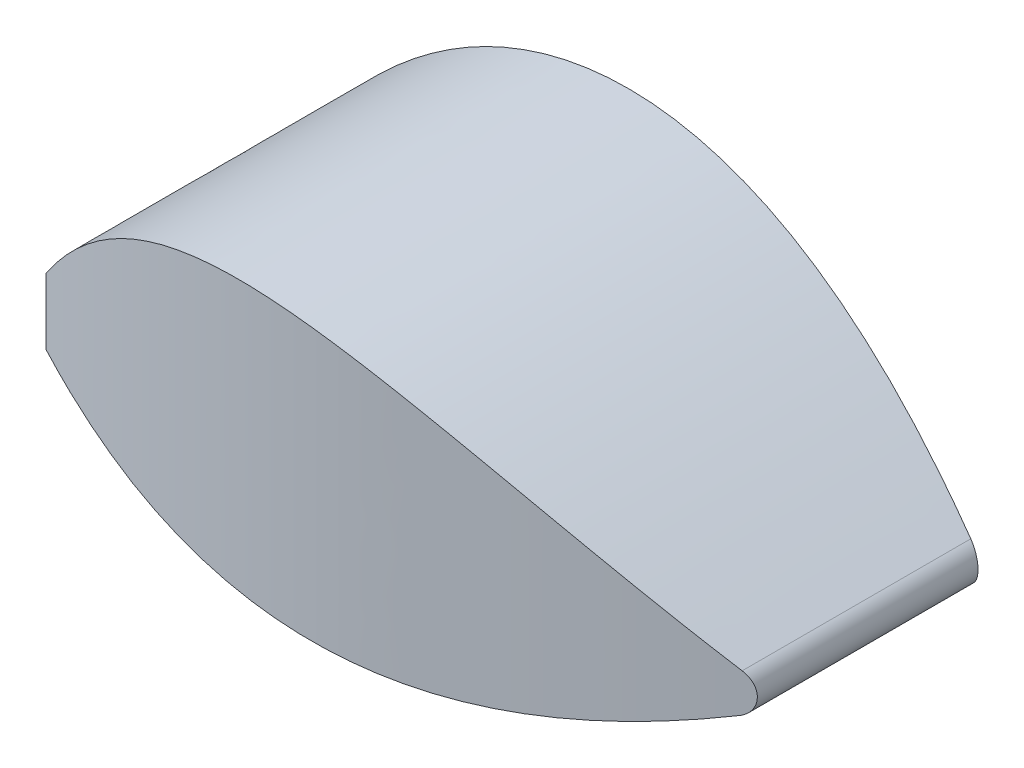
ISO-10303-21;
HEADER;
FILE_DESCRIPTION(('STEP AP214'),'2;1');
FILE_NAME('part.step','',(''),(''),'','','');
FILE_SCHEMA(('AUTOMOTIVE_DESIGN { 1 0 10303 214 1 1 1 1 }'));
ENDSEC;
DATA;
#1=APPLICATION_CONTEXT('core data for automotive mechanical design processes');
#2=APPLICATION_PROTOCOL_DEFINITION('international standard','automotive_design',2000,#1);
#3=PRODUCT_CONTEXT('',#1,'mechanical');
#4=PRODUCT('Part','Part','',(#3));
#5=PRODUCT_RELATED_PRODUCT_CATEGORY('part','',(#4));
#6=PRODUCT_DEFINITION_FORMATION('','',#4);
#7=PRODUCT_DEFINITION_CONTEXT('part definition',#1,'design');
#8=PRODUCT_DEFINITION('design','',#6,#7);
#9=PRODUCT_DEFINITION_SHAPE('','',#8);
#10=(LENGTH_UNIT() NAMED_UNIT(*) SI_UNIT(.MILLI.,.METRE.));
#11=(NAMED_UNIT(*) PLANE_ANGLE_UNIT() SI_UNIT($,.RADIAN.));
#12=(NAMED_UNIT(*) SI_UNIT($,.STERADIAN.) SOLID_ANGLE_UNIT());
#13=UNCERTAINTY_MEASURE_WITH_UNIT(LENGTH_MEASURE(1.E-05),#10,'distance_accuracy_value','');
#14=(GEOMETRIC_REPRESENTATION_CONTEXT(3) GLOBAL_UNCERTAINTY_ASSIGNED_CONTEXT((#13)) GLOBAL_UNIT_ASSIGNED_CONTEXT((#10,
#11,#12)) REPRESENTATION_CONTEXT('',''));
#15=CARTESIAN_POINT('',(0.,0.,0.));
#16=DIRECTION('',(0.,0.,1.));
#17=DIRECTION('',(1.,0.,0.));
#18=AXIS2_PLACEMENT_3D('',#15,#16,#17);
#19=CARTESIAN_POINT('',(0.,-5.,100.));
#20=CARTESIAN_POINT('',(72.416253581462,-43.6997759159744,100.));
#21=CARTESIAN_POINT('',(160.,0.,100.));
#22=B_SPLINE_CURVE_WITH_KNOTS('',2,(#19,#20,#21),.UNSPECIFIED.,.F.,.F.,(3,3),(0.,1.),.UNSPECIFIED.);
#23=DIRECTION('',(0.,0.,-1.));
#24=VECTOR('',#23,1.);
#25=SURFACE_OF_LINEAR_EXTRUSION('',#22,#24);
#26=CARTESIAN_POINT('',(151.258789821791,-4.17343857519206,23.9622297205045));
#27=CARTESIAN_POINT('',(149.629357965363,-4.91603687519148,23.394019523679));
#28=CARTESIAN_POINT('',(147.988835361183,-5.64378346732213,22.8379919709254));
#29=CARTESIAN_POINT('',(144.682483143088,-7.06858256654349,21.7506631900371));
#30=CARTESIAN_POINT('',(143.016612271083,-7.76557570370821,21.2194096849434));
#31=CARTESIAN_POINT('',(139.660505877791,-9.12590652645623,20.1834978969047));
#32=CARTESIAN_POINT('',(137.970244037804,-9.7892037215443,19.6788715834383));
#33=CARTESIAN_POINT('',(134.566342790178,-11.0791357597028,18.6980493062904));
#34=CARTESIAN_POINT('',(132.8526898071,-11.705748090225,18.2218707966972));
#35=CARTESIAN_POINT('',(129.403003919074,-12.919312088216,17.2997187243181));
#36=CARTESIAN_POINT('',(127.666967525827,-13.5062574826928,16.8537499389197));
#37=CARTESIAN_POINT('',(124.156315818451,-14.643065546739,15.9894936303634));
#38=CARTESIAN_POINT('',(122.3814896934,-15.19251388836,15.5715161267573));
#39=CARTESIAN_POINT('',(118.811147808517,-16.2448237785107,14.7698165161902));
#40=CARTESIAN_POINT('',(117.015640103743,-16.7477028180595,14.3860815500215));
#41=CARTESIAN_POINT('',(113.405036375048,-17.7038151314775,13.654489951865));
#42=CARTESIAN_POINT('',(111.589949111493,-18.1570696726153,13.3066179540652));
#43=CARTESIAN_POINT('',(107.941312874577,-19.0109002293617,12.6482941502864));
#44=CARTESIAN_POINT('',(106.107770172912,-19.4114935306788,12.337830068209));
#45=CARTESIAN_POINT('',(102.423371204516,-20.1570041366292,11.7557764706642));
#46=CARTESIAN_POINT('',(100.572516114829,-20.5019251976437,11.4841843325247));
#47=CARTESIAN_POINT('',(96.8936941594391,-21.1265128207243,10.9865146351575));
#48=CARTESIAN_POINT('',(95.0660428821556,-21.4073788375664,10.7596136641098));
#49=CARTESIAN_POINT('',(91.3979057191564,-21.9099885299395,10.3457314707962));
#50=CARTESIAN_POINT('',(89.5574185310056,-22.1317261135548,10.1587543622223));
#51=CARTESIAN_POINT('',(85.8663464304428,-22.5134075424498,9.82584849321983));
#52=CARTESIAN_POINT('',(84.0157616488021,-22.6733521860766,9.67991920247191));
#53=CARTESIAN_POINT('',(80.3072824962775,-22.9290727979192,9.42999076908724));
#54=CARTESIAN_POINT('',(78.4493880064056,-23.0248477171912,9.3259923118796));
#55=CARTESIAN_POINT('',(74.7377830496757,-23.1498866074063,9.16093604565051));
#56=CARTESIAN_POINT('',(72.8840911069303,-23.1794465189832,9.09968801775262));
#57=CARTESIAN_POINT('',(69.1758313285062,-23.171286152878,9.01972541587881));
#58=CARTESIAN_POINT('',(67.3212634554601,-23.1335626846201,9.00101285902939));
#59=CARTESIAN_POINT('',(63.6149017127665,-22.9896371676879,9.00616378532164));
#60=CARTESIAN_POINT('',(61.7631077437641,-22.8834376334423,9.03002570519317));
#61=CARTESIAN_POINT('',(58.0659248850543,-22.6018695936952,9.12003039479406));
#62=CARTESIAN_POINT('',(56.2205356104047,-22.4265053204684,9.18617057761859));
#63=CARTESIAN_POINT('',(52.534164288561,-22.0058011989558,9.36036915223744));
#64=CARTESIAN_POINT('',(50.6932116829687,-21.7602547377305,9.46855165790413));
#65=CARTESIAN_POINT('',(47.024699781652,-21.1997325978513,9.72588271319656));
#66=CARTESIAN_POINT('',(45.1971411751757,-20.8847533717873,9.87503335603341));
#67=CARTESIAN_POINT('',(41.5587648653122,-20.1862150514423,10.2130604912354));
#68=CARTESIAN_POINT('',(39.7479483195401,-19.8026512516902,10.4019397094675));
#69=CARTESIAN_POINT('',(36.1462805910868,-18.9682962993664,10.8179064743124));
#70=CARTESIAN_POINT('',(34.3554298365213,-18.5175037082124,11.0449948385495));
#71=CARTESIAN_POINT('',(30.7937844731577,-17.5497161597789,11.5360217158903));
#72=CARTESIAN_POINT('',(29.0230255766926,-17.0326188557803,11.8000172563335));
#73=CARTESIAN_POINT('',(25.5069725098136,-15.9349371480605,12.362658335993));
#74=CARTESIAN_POINT('',(23.7616773836276,-15.354355134196,12.6613025708988));
#75=CARTESIAN_POINT('',(20.2988507898422,-14.1322139553528,13.2911580091115));
#76=CARTESIAN_POINT('',(18.581315617462,-13.4906630071004,13.6223648241971));
#77=CARTESIAN_POINT('',(15.1760810393484,-12.1493920051962,14.3151451859012));
#78=CARTESIAN_POINT('',(13.4883705536769,-11.4496941286229,14.6767071556821));
#79=CARTESIAN_POINT('',(11.1431684235464,-10.4295683440263,15.2035717530321));
#80=CARTESIAN_POINT('',(10.4727863633921,-10.1323889696253,15.3570254799524));
#81=CARTESIAN_POINT('',(9.13715631005365,-9.52927574180901,15.6683502779554));
#82=CARTESIAN_POINT('',(8.47190735140379,-9.22334358828063,15.826220491177));
#83=CARTESIAN_POINT('',(7.14654657587931,-8.60288865534712,16.1462514663857));
#84=CARTESIAN_POINT('',(6.48643430705416,-8.28836664295571,16.3084118452512));
#85=CARTESIAN_POINT('',(5.1735998264917,-7.65198876541682,16.6363347727806));
#86=CARTESIAN_POINT('',(4.52086000231495,-7.33016185781278,16.8020830074816));
#87=CARTESIAN_POINT('',(3.22046251600921,-6.67829313579478,17.1375977254619));
#88=CARTESIAN_POINT('',(2.57280529827206,-6.34825061335507,17.3073645550033));
#89=CARTESIAN_POINT('',(1.28256298563081,-5.68010962345996,17.650797151833));
#90=CARTESIAN_POINT('',(0.639978710991753,-5.34200988733384,17.8244635328839));
#91=CARTESIAN_POINT('',(0.,-5.,18.));
#92=B_SPLINE_CURVE_WITH_KNOTS('',3,(#26,#27,#28,#29,#30,#31,#32,#33,#34,#35,#36,#37,#38,#39,#40,
#41,#42,#43,#44,#45,#46,#47,#48,#49,#50,#51,#52,#53,#54,#55,#56,#57,#58,#59,#60,#61,#62,#63,#64,
#65,#66,#67,#68,#69,#70,#71,#72,#73,#74,#75,#76,#77,#78,#79,#80,#81,#82,#83,#84,#85,#86,#87,#88,
#89,#90,#91),.UNSPECIFIED.,.F.,.F.,(4,2,2,2,2,2,2,2,2,2,2,2,2,2,2,2,2,2,2,2,2,2,2,2,2,2,2,2,2,2,
2,2,4),(0.,5.63594405589941,11.2823306703745,16.9353490779194,22.5918009964138,28.2491453520467,
33.9612958850928,39.6712922086545,45.3788317751573,51.0844931760289,56.7897694368882,
62.3773400566205,67.9654861333239,73.5535600103689,79.1417252300581,84.704864506725,
90.2682675943063,95.8314664063765,101.394324852323,106.973731808479,112.553423889873,
118.133498931457,123.713693394335,129.302607435538,134.891311156689,140.479262758698,
146.065092827402,148.312584812193,150.559643233021,152.806501659224,155.045629198126,
157.28495037883,159.524626518653),.UNSPECIFIED.);
#93=CARTESIAN_POINT('',(151.258789821792,-4.17343857519156,23.9622297205049));
#94=VERTEX_POINT('',#93);
#95=CARTESIAN_POINT('',(0.,-5.,18.));
#96=VERTEX_POINT('',#95);
#97=EDGE_CURVE('E179',#94,#96,#92,.T.);
#98=ORIENTED_EDGE('',*,*,#97,.F.);
#99=DIRECTION('',(0.,0.,-1.));
#100=VECTOR('',#99,1.);
#101=CARTESIAN_POINT('',(151.258789821792,-4.17343857519157,0.));
#102=LINE('',#101,#100);
#103=CARTESIAN_POINT('',(151.258789821792,-4.17343857519156,76.0377702794951));
#104=VERTEX_POINT('',#103);
#105=EDGE_CURVE('E136',#94,#104,#102,.F.);
#106=ORIENTED_EDGE('',*,*,#105,.T.);
#107=CARTESIAN_POINT('',(151.258789821791,-4.17343857519206,76.0377702794955));
#108=CARTESIAN_POINT('',(149.629357965363,-4.91603687519148,76.605980476321));
#109=CARTESIAN_POINT('',(147.988835361183,-5.64378346732213,77.1620080290746));
#110=CARTESIAN_POINT('',(144.682483143088,-7.06858256654349,78.2493368099629));
#111=CARTESIAN_POINT('',(143.016612271083,-7.76557570370821,78.7805903150566));
#112=CARTESIAN_POINT('',(139.660505877791,-9.12590652645624,79.8165021030952));
#113=CARTESIAN_POINT('',(137.970244037804,-9.78920372154431,80.3211284165617));
#114=CARTESIAN_POINT('',(134.566342790178,-11.0791357597028,81.3019506937096));
#115=CARTESIAN_POINT('',(132.8526898071,-11.705748090225,81.7781292033027));
#116=CARTESIAN_POINT('',(129.403003919074,-12.919312088216,82.7002812756819));
#117=CARTESIAN_POINT('',(127.666967525827,-13.5062574826928,83.1462500610802));
#118=CARTESIAN_POINT('',(124.156315818451,-14.643065546739,84.0105063696366));
#119=CARTESIAN_POINT('',(122.3814896934,-15.19251388836,84.4284838732427));
#120=CARTESIAN_POINT('',(118.811147808517,-16.2448237785108,85.2301834838098));
#121=CARTESIAN_POINT('',(117.015640103743,-16.7477028180595,85.6139184499785));
#122=CARTESIAN_POINT('',(113.405036375048,-17.7038151314775,86.345510048135));
#123=CARTESIAN_POINT('',(111.589949111493,-18.1570696726153,86.6933820459348));
#124=CARTESIAN_POINT('',(107.941312874577,-19.0109002293617,87.3517058497135));
#125=CARTESIAN_POINT('',(106.107770172912,-19.4114935306788,87.662169931791));
#126=CARTESIAN_POINT('',(102.423371204516,-20.1570041366292,88.2442235293358));
#127=CARTESIAN_POINT('',(100.572516114829,-20.5019251976437,88.5158156674753));
#128=CARTESIAN_POINT('',(96.8936941594391,-21.1265128207243,89.0134853648425));
#129=CARTESIAN_POINT('',(95.0660428821556,-21.4073788375664,89.2403863358901));
#130=CARTESIAN_POINT('',(91.3979057191564,-21.9099885299395,89.6542685292038));
#131=CARTESIAN_POINT('',(89.5574185310056,-22.1317261135548,89.8412456377777));
#132=CARTESIAN_POINT('',(85.8663464304428,-22.5134075424498,90.1741515067801));
#133=CARTESIAN_POINT('',(84.0157616488021,-22.6733521860766,90.3200807975281));
#134=CARTESIAN_POINT('',(80.3072824962775,-22.9290727979192,90.5700092309127));
#135=CARTESIAN_POINT('',(78.4493880064056,-23.0248477171912,90.6740076881204));
#136=CARTESIAN_POINT('',(74.7377830496756,-23.1498866074063,90.8390639543495));
#137=CARTESIAN_POINT('',(72.8840911069302,-23.1794465189832,90.9003119822473));
#138=CARTESIAN_POINT('',(69.1758313285061,-23.171286152878,90.9802745841212));
#139=CARTESIAN_POINT('',(67.3212634554601,-23.1335626846201,90.9989871409706));
#140=CARTESIAN_POINT('',(63.6149017127664,-22.9896371676879,90.9938362146783));
#141=CARTESIAN_POINT('',(61.7631077437641,-22.8834376334423,90.9699742948068));
#142=CARTESIAN_POINT('',(58.0659248850543,-22.6018695936951,90.8799696052059));
#143=CARTESIAN_POINT('',(56.2205356104047,-22.4265053204684,90.8138294223814));
#144=CARTESIAN_POINT('',(52.534164288561,-22.0058011989558,90.6396308477625));
#145=CARTESIAN_POINT('',(50.6932116829686,-21.7602547377305,90.5314483420958));
#146=CARTESIAN_POINT('',(47.024699781652,-21.1997325978513,90.2741172868034));
#147=CARTESIAN_POINT('',(45.1971411751757,-20.8847533717873,90.1249666439666));
#148=CARTESIAN_POINT('',(41.5587648653122,-20.1862150514423,89.7869395087646));
#149=CARTESIAN_POINT('',(39.7479483195401,-19.8026512516902,89.5980602905325));
#150=CARTESIAN_POINT('',(36.1462805910868,-18.9682962993664,89.1820935256876));
#151=CARTESIAN_POINT('',(34.3554298365213,-18.5175037082124,88.9550051614505));
#152=CARTESIAN_POINT('',(30.7937844731577,-17.5497161597789,88.4639782841097));
#153=CARTESIAN_POINT('',(29.0230255766926,-17.0326188557802,88.1999827436665));
#154=CARTESIAN_POINT('',(25.5069725098136,-15.9349371480605,87.637341664007));
#155=CARTESIAN_POINT('',(23.7616773836276,-15.354355134196,87.3386974291012));
#156=CARTESIAN_POINT('',(20.2988507898422,-14.1322139553528,86.7088419908885));
#157=CARTESIAN_POINT('',(18.581315617462,-13.4906630071004,86.3776351758029));
#158=CARTESIAN_POINT('',(15.1760810393484,-12.1493920051962,85.6848548140989));
#159=CARTESIAN_POINT('',(13.4883705536769,-11.4496941286229,85.3232928443179));
#160=CARTESIAN_POINT('',(11.1431684235463,-10.4295683440263,84.7964282469679));
#161=CARTESIAN_POINT('',(10.4727863633921,-10.1323889696253,84.6429745200476));
#162=CARTESIAN_POINT('',(9.13715631005363,-9.529275741809,84.3316497220446));
#163=CARTESIAN_POINT('',(8.47190735140377,-9.22334358828062,84.173779508823));
#164=CARTESIAN_POINT('',(7.14654657587929,-8.60288865534712,83.8537485336143));
#165=CARTESIAN_POINT('',(6.48643430705414,-8.28836664295571,83.6915881547488));
#166=CARTESIAN_POINT('',(5.17359982649169,-7.65198876541682,83.3636652272194));
#167=CARTESIAN_POINT('',(4.52086000231494,-7.33016185781278,83.1979169925184));
#168=CARTESIAN_POINT('',(3.2204625160092,-6.67829313579477,82.8624022745382));
#169=CARTESIAN_POINT('',(2.57280529827205,-6.34825061335507,82.6926354449968));
#170=CARTESIAN_POINT('',(1.28256298563081,-5.68010962345996,82.349202848167));
#171=CARTESIAN_POINT('',(0.639978710991753,-5.34200988733383,82.1755364671161));
#172=CARTESIAN_POINT('',(0.,-5.,82.));
#173=B_SPLINE_CURVE_WITH_KNOTS('',3,(#107,#108,#109,#110,#111,#112,#113,#114,#115,#116,#117,
#118,#119,#120,#121,#122,#123,#124,#125,#126,#127,#128,#129,#130,#131,#132,#133,#134,#135,#136,
#137,#138,#139,#140,#141,#142,#143,#144,#145,#146,#147,#148,#149,#150,#151,#152,#153,#154,#155,
#156,#157,#158,#159,#160,#161,#162,#163,#164,#165,#166,#167,#168,#169,#170,#171,#172),
.UNSPECIFIED.,.F.,.F.,(4,2,2,2,2,2,2,2,2,2,2,2,2,2,2,2,2,2,2,2,2,2,2,2,2,2,2,2,2,2,2,2,4),(0.,
5.6359440558994,11.2823306703745,16.9353490779194,22.5918009964138,28.2491453520467,
33.9612958850928,39.6712922086545,45.3788317751573,51.0844931760289,56.7897694368882,
62.3773400566205,67.9654861333239,73.553560010369,79.1417252300581,84.704864506725,
90.2682675943064,95.8314664063766,101.394324852323,106.973731808479,112.553423889873,
118.133498931457,123.713693394335,129.302607435538,134.891311156689,140.479262758699,
146.065092827402,148.312584812193,150.559643233021,152.806501659224,155.045629198126,
157.28495037883,159.524626518653),.UNSPECIFIED.);
#174=CARTESIAN_POINT('',(0.,-5.,82.));
#175=VERTEX_POINT('',#174);
#176=EDGE_CURVE('E110',#104,#175,#173,.T.);
#177=ORIENTED_EDGE('',*,*,#176,.T.);
#178=DIRECTION('',(0.,0.,-1.));
#179=VECTOR('',#178,1.);
#180=CARTESIAN_POINT('',(0.,-5.,100.));
#181=LINE('',#180,#179);
#182=EDGE_CURVE('E120',#175,#96,#181,.T.);
#183=ORIENTED_EDGE('',*,*,#182,.T.);
#184=EDGE_LOOP('',(#98,#106,#177,#183));
#185=FACE_BOUND('',#184,.T.);
#186=ADVANCED_FACE('F32',(#185),#25,.F.);
#187=CARTESIAN_POINT('',(160.,0.,100.));
#188=CARTESIAN_POINT('',(116.18049526204,24.6913777628234,100.));
#189=CARTESIAN_POINT('',(44.0967760553984,69.0938147512923,100.));
#190=CARTESIAN_POINT('',(0.,10.,100.));
#191=B_SPLINE_CURVE_WITH_KNOTS('',3,(#187,#188,#189,#190),.UNSPECIFIED.,.F.,.F.,(4,4),(0.,1.),.UNSPECIFIED.);
#192=DIRECTION('',(0.,0.,-1.));
#193=VECTOR('',#192,1.);
#194=SURFACE_OF_LINEAR_EXTRUSION('',#191,#193);
#195=CARTESIAN_POINT('',(0.,10.,18.));
#196=CARTESIAN_POINT('',(0.484520233790782,10.6493005364469,17.867106977892));
#197=CARTESIAN_POINT('',(0.977139889537333,11.2924360844573,17.7334670349872));
#198=CARTESIAN_POINT('',(1.9795761214335,12.566193322621,17.4647442408425));
#199=CARTESIAN_POINT('',(2.48941350677136,13.1967982923244,17.3296597890349));
#200=CARTESIAN_POINT('',(3.52646569840847,14.4441528954597,17.0583297873622));
#201=CARTESIAN_POINT('',(4.05369351112891,15.0608915506339,16.9220834276757));
#202=CARTESIAN_POINT('',(5.1256731835889,16.2791822221383,16.6487407779089));
#203=CARTESIAN_POINT('',(5.67043147993003,16.8807285122614,16.5116441909188));
#204=CARTESIAN_POINT('',(6.77759293474142,18.0673350321691,16.2369320674961));
#205=CARTESIAN_POINT('',(7.33999740154309,18.6523940334114,16.0993164932532));
#206=CARTESIAN_POINT('',(8.48634260568645,19.8085919920521,15.8230031757561));
#207=CARTESIAN_POINT('',(9.07039999735758,20.379615098173,15.6843042341876));
#208=CARTESIAN_POINT('',(10.2565252675061,21.5023955888648,15.4071245358341));
#209=CARTESIAN_POINT('',(10.8585885736588,22.0541577886019,15.2686437329021));
#210=CARTESIAN_POINT('',(12.0807391585954,23.1371990754141,14.9923046026418));
#211=CARTESIAN_POINT('',(12.7008218869987,23.6684832562347,14.8544461281457));
#212=CARTESIAN_POINT('',(13.9589908265205,24.7094024432837,14.5797749427779));
#213=CARTESIAN_POINT('',(14.5970744988328,25.2190404772752,14.4429620878599));
#214=CARTESIAN_POINT('',(15.8911674249744,26.2155453338848,14.1708273691095));
#215=CARTESIAN_POINT('',(16.5471780244216,26.702410439659,14.0355056182771));
#216=CARTESIAN_POINT('',(18.0505400146391,27.7762523804754,13.7317534120955));
#217=CARTESIAN_POINT('',(18.9030927446303,28.3561411688203,13.563912380218));
#218=CARTESIAN_POINT('',(20.6353672835883,29.4755242770718,13.2324471834572));
#219=CARTESIAN_POINT('',(21.5150945484327,30.0150104098307,13.0688238776308));
#220=CARTESIAN_POINT('',(23.3002865929066,31.0513942813798,12.7469317925017));
#221=CARTESIAN_POINT('',(24.2057518645463,31.5482912053005,12.5886631156853));
#222=CARTESIAN_POINT('',(26.0407433318858,32.4976683282206,12.2786149658002));
#223=CARTESIAN_POINT('',(26.9702689607028,32.9501495724905,12.1268353400667));
#224=CARTESIAN_POINT('',(28.8475946586836,33.8074972962127,11.8314861358613));
#225=CARTESIAN_POINT('',(29.7953039127483,34.212551838322,11.6878853764917));
#226=CARTESIAN_POINT('',(31.7105500931311,34.9761828988967,11.4092808621555));
#227=CARTESIAN_POINT('',(32.6780878261166,35.3347575220894,11.2742774578702));
#228=CARTESIAN_POINT('',(34.6305591259272,36.0048192233704,11.0138747338899));
#229=CARTESIAN_POINT('',(35.6154920163179,36.3163081279683,10.8884750417489));
#230=CARTESIAN_POINT('',(37.6001294690182,36.8920474807183,10.6481983371626));
#231=CARTESIAN_POINT('',(38.5998315672666,37.1563057144872,10.5333195919444));
#232=CARTESIAN_POINT('',(40.7765095794938,37.6774395104848,10.2969533244621));
#233=CARTESIAN_POINT('',(41.9556971013365,37.9260135027473,10.177466233098));
#234=CARTESIAN_POINT('',(44.3268502141409,38.3609029463702,9.9548384693985));
#235=CARTESIAN_POINT('',(45.5188145927751,38.5472242515206,9.85169626058901));
#236=CARTESIAN_POINT('',(47.9118357797237,38.8595430855137,9.6625438400903));
#237=CARTESIAN_POINT('',(49.1128918553971,38.9855454235948,9.57653226289325));
#238=CARTESIAN_POINT('',(51.5220562876359,39.1797931213822,9.42210879148553));
#239=CARTESIAN_POINT('',(52.7301708632844,39.2479759106041,9.3537160193485));
#240=CARTESIAN_POINT('',(55.1491518324703,39.3292049377331,9.2349931225503));
#241=CARTESIAN_POINT('',(56.3600183512314,39.3422486142224,9.18466383710495));
#242=CARTESIAN_POINT('',(58.7818866592627,39.3163031617222,9.10221897911296));
#243=CARTESIAN_POINT('',(59.9928884488945,39.2773083624376,9.07010539195617));
#244=CARTESIAN_POINT('',(62.6433199296896,39.138437904552,9.01970627697146));
#245=CARTESIAN_POINT('',(64.0822899696384,39.0283741228395,9.00522349189282));
#246=CARTESIAN_POINT('',(66.9543489713084,38.7445817916105,9.00182395868429));
#247=CARTESIAN_POINT('',(68.3874358007433,38.5708319208324,9.01291577918153));
#248=CARTESIAN_POINT('',(71.2454091801234,38.1650469477838,9.06023534919331));
#249=CARTESIAN_POINT('',(72.6702923973136,37.9329896614319,9.09647267502304));
#250=CARTESIAN_POINT('',(75.5094815195723,37.4158491018862,9.19350355459675));
#251=CARTESIAN_POINT('',(76.9237875264779,37.1307663399059,9.2542968716054));
#252=CARTESIAN_POINT('',(79.7509107673089,36.5102112675742,9.40030004334609));
#253=CARTESIAN_POINT('',(81.1636405477239,36.1743837737775,9.48568618802653));
#254=CARTESIAN_POINT('',(83.9757734977873,35.4586709164316,9.67992697469505));
#255=CARTESIAN_POINT('',(85.3751804616207,35.0787985288049,9.78877471281628));
#256=CARTESIAN_POINT('',(88.1604258178763,34.2792393995102,10.0291891780901));
#257=CARTESIAN_POINT('',(89.546265439962,33.8595563036034,10.1607538257906));
#258=CARTESIAN_POINT('',(92.3040354802527,32.9843324229304,10.4458388883951));
#259=CARTESIAN_POINT('',(93.6759678137543,32.5287966536179,10.5993562347678));
#260=CARTESIAN_POINT('',(96.7464098546912,31.467795474016,10.9685560393007));
#261=CARTESIAN_POINT('',(98.4410717447953,30.8532637902248,11.190195190534));
#262=CARTESIAN_POINT('',(101.809278728178,29.5800078786221,11.6652896219784));
#263=CARTESIAN_POINT('',(103.482822075622,28.9212800252531,11.9187475138749));
#264=CARTESIAN_POINT('',(106.810031520406,27.5649488850404,12.4563410341578));
#265=CARTESIAN_POINT('',(108.463687472942,26.8673267018273,12.7404916382112));
#266=CARTESIAN_POINT('',(111.752115313109,25.4380772054489,13.3384110082302));
#267=CARTESIAN_POINT('',(113.386874024449,24.7064277646013,13.6521991879596));
#268=CARTESIAN_POINT('',(116.638342614691,23.2136411312367,14.3084016035799));
#269=CARTESIAN_POINT('',(118.25504027295,22.4524853665364,14.6508340313284));
#270=CARTESIAN_POINT('',(121.471096880077,20.904946940753,15.3633890631816));
#271=CARTESIAN_POINT('',(123.07044735376,20.1185526316452,15.7335245608323));
#272=CARTESIAN_POINT('',(126.204849002901,18.548456459613,16.4891299076228));
#273=CARTESIAN_POINT('',(127.740398011542,17.7653698552214,16.8738165168777));
#274=CARTESIAN_POINT('',(130.796265319087,16.1829455011656,17.6676469550472));
#275=CARTESIAN_POINT('',(132.316586862739,15.3836113285368,18.0767854383537));
#276=CARTESIAN_POINT('',(135.34244263845,13.7723351468462,18.9187838296099));
#277=CARTESIAN_POINT('',(136.847986572546,12.9604024590514,19.3516267478895));
#278=CARTESIAN_POINT('',(139.844740682162,11.327621920963,20.2403458541395));
#279=CARTESIAN_POINT('',(141.335966604102,10.5067866720513,20.6961921586557));
#280=CARTESIAN_POINT('',(144.304595479898,8.86001330568283,21.6302917810455));
#281=CARTESIAN_POINT('',(145.782019191781,8.03408772413741,22.1085012408212));
#282=CARTESIAN_POINT('',(147.989169760728,6.79389448862095,22.8425211312076));
#283=CARTESIAN_POINT('',(148.722459115892,6.38080720949652,23.0896527576903));
#284=CARTESIAN_POINT('',(150.186893882309,5.55432270412928,23.5896739576288));
#285=CARTESIAN_POINT('',(150.918039299945,5.14092547881361,23.8425635139268));
#286=CARTESIAN_POINT('',(151.648222433077,4.72760787264335,24.0983383651521));
#287=B_SPLINE_CURVE_WITH_KNOTS('',3,(#195,#196,#197,#198,#199,#200,#201,#202,#203,#204,#205,
#206,#207,#208,#209,#210,#211,#212,#213,#214,#215,#216,#217,#218,#219,#220,#221,#222,#223,#224,
#225,#226,#227,#228,#229,#230,#231,#232,#233,#234,#235,#236,#237,#238,#239,#240,#241,#242,#243,
#244,#245,#246,#247,#248,#249,#250,#251,#252,#253,#254,#255,#256,#257,#258,#259,#260,#261,#262,
#263,#264,#265,#266,#267,#268,#269,#270,#271,#272,#273,#274,#275,#276,#277,#278,#279,#280,#281,
#282,#283,#284,#285,#286),.UNSPECIFIED.,.F.,.F.,(4,2,2,2,2,2,2,2,2,2,2,2,2,2,2,2,2,2,2,2,2,2,2,
2,2,2,2,2,2,2,2,2,2,2,2,2,2,2,2,2,2,2,2,2,2,4),(0.,2.4629201763643,4.92893177145309,
7.39683150927862,9.86564795402714,12.3346478775882,14.819771051865,17.30426843779,
19.7881437830796,22.2716705433999,24.7553842352272,27.8881762656137,31.0216014132573,
34.1550865000946,37.2884978263741,40.4090301659535,43.5296897088756,46.6502281667293,
49.7702517521842,53.4014057199284,57.032218144203,60.6627410351482,64.2971877674081,
67.9318033314421,71.5668149682953,75.8947268456085,80.2240889760468,84.5551007892427,
88.8860708497334,93.2488942726122,97.6104356286259,101.971577950929,106.332111270898,
111.779692487469,117.227721134763,122.678420109497,128.132714598322,133.590499779431,
139.050841107241,144.348817700618,149.645640270519,154.938714910047,160.225082025531,
165.501484086312,168.132977861463,170.764463796211),.UNSPECIFIED.);
#288=CARTESIAN_POINT('',(0.,10.,18.));
#289=VERTEX_POINT('',#288);
#290=CARTESIAN_POINT('',(151.648222431688,4.7276078734296,24.0983383646655));
#291=VERTEX_POINT('',#290);
#292=EDGE_CURVE('E52',#289,#291,#287,.T.);
#293=ORIENTED_EDGE('',*,*,#292,.F.);
#294=DIRECTION('',(0.,0.,-1.));
#295=VECTOR('',#294,1.);
#296=CARTESIAN_POINT('',(0.,10.,100.));
#297=LINE('',#296,#295);
#298=CARTESIAN_POINT('',(0.,10.,82.));
#299=VERTEX_POINT('',#298);
#300=EDGE_CURVE('E118',#299,#289,#297,.T.);
#301=ORIENTED_EDGE('',*,*,#300,.F.);
#302=CARTESIAN_POINT('',(0.,10.,82.));
#303=CARTESIAN_POINT('',(0.484520233790786,10.6493005364469,82.132893022108));
#304=CARTESIAN_POINT('',(0.977139889537335,11.2924360844573,82.2665329650129));
#305=CARTESIAN_POINT('',(1.9795761214335,12.566193322621,82.5352557591575));
#306=CARTESIAN_POINT('',(2.48941350677136,13.1967982923244,82.6703402109651));
#307=CARTESIAN_POINT('',(3.52646569840847,14.4441528954597,82.9416702126378));
#308=CARTESIAN_POINT('',(4.05369351112891,15.0608915506339,83.0779165723243));
#309=CARTESIAN_POINT('',(5.12567318358889,16.2791822221383,83.3512592220911));
#310=CARTESIAN_POINT('',(5.67043147993003,16.8807285122614,83.4883558090812));
#311=CARTESIAN_POINT('',(6.77759293474142,18.0673350321691,83.7630679325039));
#312=CARTESIAN_POINT('',(7.33999740154308,18.6523940334114,83.9006835067469));
#313=CARTESIAN_POINT('',(8.48634260568645,19.8085919920521,84.1769968242439));
#314=CARTESIAN_POINT('',(9.07039999735758,20.379615098173,84.3156957658124));
#315=CARTESIAN_POINT('',(10.2565252675061,21.5023955888648,84.5928754641659));
#316=CARTESIAN_POINT('',(10.8585885736588,22.0541577886019,84.7313562670979));
#317=CARTESIAN_POINT('',(12.0807391585954,23.1371990754141,85.0076953973582));
#318=CARTESIAN_POINT('',(12.7008218869987,23.6684832562347,85.1455538718543));
#319=CARTESIAN_POINT('',(13.9589908265205,24.7094024432837,85.420225057222));
#320=CARTESIAN_POINT('',(14.5970744988328,25.2190404772752,85.5570379121401));
#321=CARTESIAN_POINT('',(15.8911674249744,26.2155453338848,85.8291726308905));
#322=CARTESIAN_POINT('',(16.5471780244216,26.702410439659,85.9644943817229));
#323=CARTESIAN_POINT('',(18.0505400146391,27.7762523804754,86.2682465879045));
#324=CARTESIAN_POINT('',(18.9030927446303,28.3561411688203,86.436087619782));
#325=CARTESIAN_POINT('',(20.6353672835883,29.4755242770718,86.7675528165428));
#326=CARTESIAN_POINT('',(21.5150945484327,30.0150104098307,86.9311761223691));
#327=CARTESIAN_POINT('',(23.3002865929066,31.0513942813798,87.2530682074983));
#328=CARTESIAN_POINT('',(24.2057518645463,31.5482912053005,87.4113368843147));
#329=CARTESIAN_POINT('',(26.0407433318858,32.4976683282206,87.7213850341998));
#330=CARTESIAN_POINT('',(26.9702689607028,32.9501495724905,87.8731646599333));
#331=CARTESIAN_POINT('',(28.8475946586836,33.8074972962127,88.1685138641387));
#332=CARTESIAN_POINT('',(29.7953039127483,34.2125518383219,88.3121146235083));
#333=CARTESIAN_POINT('',(31.7105500931311,34.9761828988967,88.5907191378445));
#334=CARTESIAN_POINT('',(32.6780878261166,35.3347575220894,88.7257225421298));
#335=CARTESIAN_POINT('',(34.6305591259272,36.0048192233704,88.9861252661101));
#336=CARTESIAN_POINT('',(35.6154920163179,36.3163081279683,89.1115249582511));
#337=CARTESIAN_POINT('',(37.6001294690182,36.8920474807183,89.3518016628374));
#338=CARTESIAN_POINT('',(38.5998315672666,37.1563057144872,89.4666804080556));
#339=CARTESIAN_POINT('',(40.7765095794938,37.6774395104848,89.7030466755379));
#340=CARTESIAN_POINT('',(41.9556971013365,37.9260135027473,89.822533766902));
#341=CARTESIAN_POINT('',(44.3268502141409,38.3609029463702,90.0451615306015));
#342=CARTESIAN_POINT('',(45.5188145927751,38.5472242515206,90.1483037394109));
#343=CARTESIAN_POINT('',(47.9118357797237,38.8595430855137,90.3374561599097));
#344=CARTESIAN_POINT('',(49.1128918553971,38.9855454235948,90.4234677371067));
#345=CARTESIAN_POINT('',(51.522056287636,39.1797931213822,90.5778912085145));
#346=CARTESIAN_POINT('',(52.7301708632845,39.2479759106041,90.6462839806515));
#347=CARTESIAN_POINT('',(55.1491518324703,39.3292049377331,90.7650068774497));
#348=CARTESIAN_POINT('',(56.3600183512314,39.3422486142224,90.815336162895));
#349=CARTESIAN_POINT('',(58.7818866592627,39.3163031617222,90.897781020887));
#350=CARTESIAN_POINT('',(59.9928884488945,39.2773083624376,90.9298946080438));
#351=CARTESIAN_POINT('',(62.6433199296896,39.138437904552,90.9802937230285));
#352=CARTESIAN_POINT('',(64.0822899696384,39.0283741228395,90.9947765081072));
#353=CARTESIAN_POINT('',(66.9543489713085,38.7445817916105,90.9981760413157));
#354=CARTESIAN_POINT('',(68.3874358007433,38.5708319208325,90.9870842208185));
#355=CARTESIAN_POINT('',(71.2454091801234,38.1650469477838,90.9397646508067));
#356=CARTESIAN_POINT('',(72.6702923973137,37.9329896614319,90.9035273249769));
#357=CARTESIAN_POINT('',(75.5094815195723,37.4158491018862,90.8064964454032));
#358=CARTESIAN_POINT('',(76.9237875264779,37.1307663399059,90.7457031283946));
#359=CARTESIAN_POINT('',(79.750910767309,36.5102112675742,90.5996999566539));
#360=CARTESIAN_POINT('',(81.163640547724,36.1743837737775,90.5143138119735));
#361=CARTESIAN_POINT('',(83.9757734977873,35.4586709164316,90.3200730253049));
#362=CARTESIAN_POINT('',(85.3751804616207,35.0787985288049,90.2112252871837));
#363=CARTESIAN_POINT('',(88.1604258178763,34.2792393995102,89.9708108219099));
#364=CARTESIAN_POINT('',(89.5462654399621,33.8595563036034,89.8392461742094));
#365=CARTESIAN_POINT('',(92.3040354802527,32.9843324229304,89.5541611116049));
#366=CARTESIAN_POINT('',(93.6759678137544,32.5287966536179,89.4006437652322));
#367=CARTESIAN_POINT('',(96.7464098546912,31.467795474016,89.0314439606993));
#368=CARTESIAN_POINT('',(98.4410717447953,30.8532637902248,88.809804809466));
#369=CARTESIAN_POINT('',(101.809278728178,29.580007878622,88.3347103780216));
#370=CARTESIAN_POINT('',(103.482822075622,28.9212800252531,88.081252486125));
#371=CARTESIAN_POINT('',(106.810031520406,27.5649488850404,87.5436589658422));
#372=CARTESIAN_POINT('',(108.463687472942,26.8673267018273,87.2595083617887));
#373=CARTESIAN_POINT('',(111.752115313109,25.4380772054489,86.6615889917698));
#374=CARTESIAN_POINT('',(113.386874024449,24.7064277646013,86.3478008120404));
#375=CARTESIAN_POINT('',(116.638342614691,23.2136411312367,85.6915983964201));
#376=CARTESIAN_POINT('',(118.255040272949,22.4524853665364,85.3491659686716));
#377=CARTESIAN_POINT('',(121.471096880077,20.904946940753,84.6366109368184));
#378=CARTESIAN_POINT('',(123.07044735376,20.1185526316452,84.2664754391677));
#379=CARTESIAN_POINT('',(126.204849002901,18.548456459613,83.5108700923772));
#380=CARTESIAN_POINT('',(127.740398011542,17.7653698552214,83.1261834831222));
#381=CARTESIAN_POINT('',(130.796265319087,16.1829455011656,82.3323530449528));
#382=CARTESIAN_POINT('',(132.316586862739,15.3836113285369,81.9232145616463));
#383=CARTESIAN_POINT('',(135.34244263845,13.7723351468462,81.0812161703901));
#384=CARTESIAN_POINT('',(136.847986572546,12.9604024590515,80.6483732521105));
#385=CARTESIAN_POINT('',(139.844740682162,11.3276219209631,79.7596541458605));
#386=CARTESIAN_POINT('',(141.335966604102,10.5067866720514,79.3038078413443));
#387=CARTESIAN_POINT('',(144.304595479898,8.86001330568286,78.3697082189545));
#388=CARTESIAN_POINT('',(145.782019191781,8.03408772413743,77.8914987591787));
#389=CARTESIAN_POINT('',(147.989169760728,6.79389448862098,77.1574788687924));
#390=CARTESIAN_POINT('',(148.722459115892,6.38080720949655,76.9103472423097));
#391=CARTESIAN_POINT('',(150.186893882309,5.55432270412932,76.4103260423712));
#392=CARTESIAN_POINT('',(150.918039299945,5.14092547881365,76.1574364860732));
#393=CARTESIAN_POINT('',(151.648222433077,4.72760787264338,75.9016616348479));
#394=B_SPLINE_CURVE_WITH_KNOTS('',3,(#302,#303,#304,#305,#306,#307,#308,#309,#310,#311,#312,
#313,#314,#315,#316,#317,#318,#319,#320,#321,#322,#323,#324,#325,#326,#327,#328,#329,#330,#331,
#332,#333,#334,#335,#336,#337,#338,#339,#340,#341,#342,#343,#344,#345,#346,#347,#348,#349,#350,
#351,#352,#353,#354,#355,#356,#357,#358,#359,#360,#361,#362,#363,#364,#365,#366,#367,#368,#369,
#370,#371,#372,#373,#374,#375,#376,#377,#378,#379,#380,#381,#382,#383,#384,#385,#386,#387,#388,
#389,#390,#391,#392,#393),.UNSPECIFIED.,.F.,.F.,(4,2,2,2,2,2,2,2,2,2,2,2,2,2,2,2,2,2,2,2,2,2,2,
2,2,2,2,2,2,2,2,2,2,2,2,2,2,2,2,2,2,2,2,2,2,4),(0.,2.4629201763643,4.92893177145308,
7.39683150927862,9.86564795402713,12.3346478775882,14.819771051865,17.30426843779,
19.7881437830796,22.2716705433999,24.7553842352272,27.8881762656137,31.0216014132573,
34.1550865000946,37.2884978263741,40.4090301659535,43.5296897088756,46.6502281667292,
49.7702517521842,53.4014057199284,57.032218144203,60.6627410351482,64.2971877674081,
67.9318033314421,71.5668149682952,75.8947268456085,80.2240889760468,84.5551007892427,
88.8860708497333,93.2488942726122,97.6104356286259,101.971577950929,106.332111270898,
111.779692487469,117.227721134763,122.678420109497,128.132714598322,133.590499779431,
139.050841107241,144.348817700618,149.645640270519,154.938714910047,160.225082025531,
165.501484086312,168.132977861463,170.76446379621),.UNSPECIFIED.);
#395=CARTESIAN_POINT('',(151.648222431688,4.7276078734296,75.9016616353345));
#396=VERTEX_POINT('',#395);
#397=EDGE_CURVE('E100',#299,#396,#394,.T.);
#398=ORIENTED_EDGE('',*,*,#397,.T.);
#399=DIRECTION('',(0.,0.,-1.));
#400=VECTOR('',#399,1.);
#401=CARTESIAN_POINT('',(151.648222431688,4.7276078734296,100.));
#402=LINE('',#401,#400);
#403=EDGE_CURVE('E125',#396,#291,#402,.T.);
#404=ORIENTED_EDGE('',*,*,#403,.T.);
#405=EDGE_LOOP('',(#293,#301,#398,#404));
#406=FACE_BOUND('',#405,.T.);
#407=ADVANCED_FACE('F122',(#406),#194,.F.);
#408=CARTESIAN_POINT('',(0.,5.,100.));
#409=DIRECTION('',(1.,0.,0.));
#410=DIRECTION('',(0.,0.,-1.));
#411=AXIS2_PLACEMENT_3D('',#408,#409,#410);
#412=PLANE('',#411);
#413=DIRECTION('',(0.,0.,-1.));
#414=VECTOR('',#413,1.);
#415=CARTESIAN_POINT('',(0.,9.6,33.8));
#416=LINE('',#415,#414);
#417=CARTESIAN_POINT('',(0.,9.6,66.2));
#418=VERTEX_POINT('',#417);
#419=CARTESIAN_POINT('',(0.,9.6,33.8));
#420=VERTEX_POINT('',#419);
#421=EDGE_CURVE('E199',#418,#420,#416,.T.);
#422=ORIENTED_EDGE('',*,*,#421,.F.);
#423=DIRECTION('',(0.,1.,0.));
#424=VECTOR('',#423,1.);
#425=CARTESIAN_POINT('',(0.,9.6,66.2));
#426=LINE('',#425,#424);
#427=CARTESIAN_POINT('',(0.,4.,66.2));
#428=VERTEX_POINT('',#427);
#429=EDGE_CURVE('E59',#428,#418,#426,.T.);
#430=ORIENTED_EDGE('',*,*,#429,.F.);
#431=DIRECTION('',(0.,0.,1.));
#432=VECTOR('',#431,1.);
#433=CARTESIAN_POINT('',(0.,4.,33.8));
#434=LINE('',#433,#432);
#435=CARTESIAN_POINT('',(0.,4.,33.8));
#436=VERTEX_POINT('',#435);
#437=EDGE_CURVE('E188',#436,#428,#434,.T.);
#438=ORIENTED_EDGE('',*,*,#437,.F.);
#439=DIRECTION('',(0.,-1.,0.));
#440=VECTOR('',#439,1.);
#441=CARTESIAN_POINT('',(0.,9.6,33.8));
#442=LINE('',#441,#440);
#443=EDGE_CURVE('E202',#420,#436,#442,.T.);
#444=ORIENTED_EDGE('',*,*,#443,.F.);
#445=EDGE_LOOP('',(#422,#430,#438,#444));
#446=FACE_BOUND('',#445,.T.);
#447=DIRECTION('',(0.,-1.,0.));
#448=VECTOR('',#447,1.);
#449=CARTESIAN_POINT('',(0.,70.,18.));
#450=LINE('',#449,#448);
#451=EDGE_CURVE('E111',#289,#96,#450,.T.);
#452=ORIENTED_EDGE('',*,*,#451,.T.);
#453=ORIENTED_EDGE('',*,*,#182,.F.);
#454=DIRECTION('',(0.,-1.,0.));
#455=VECTOR('',#454,1.);
#456=CARTESIAN_POINT('',(0.,70.,82.));
#457=LINE('',#456,#455);
#458=EDGE_CURVE('E104',#299,#175,#457,.T.);
#459=ORIENTED_EDGE('',*,*,#458,.F.);
#460=ORIENTED_EDGE('',*,*,#300,.T.);
#461=EDGE_LOOP('',(#452,#453,#459,#460));
#462=FACE_BOUND('',#461,.T.);
#463=ADVANCED_FACE('F117',(#446,#462),#412,.F.);
#464=CARTESIAN_POINT('',(149.185229250438,0.376324776558545,50.));
#465=DIRECTION('',(0.,0.,-1.));
#466=DIRECTION('',(-1.,0.,0.));
#467=AXIS2_PLACEMENT_3D('',#464,#465,#466);
#468=CYLINDRICAL_SURFACE('',#467,5.);
#469=ORIENTED_EDGE('',*,*,#105,.F.);
#470=CARTESIAN_POINT('',(151.258789821792,-4.17343857519156,23.9622297205049));
#471=CARTESIAN_POINT('',(151.387003059356,-4.11501732507231,24.0069394623457));
#472=CARTESIAN_POINT('',(151.512946839523,-4.05106153373442,24.0509587353387));
#473=CARTESIAN_POINT('',(151.759439098626,-3.91242953777359,24.137290973052));
#474=CARTESIAN_POINT('',(151.879986403095,-3.83775101423194,24.1796035661405));
#475=CARTESIAN_POINT('',(152.114991644789,-3.67789913451016,24.2622543059335));
#476=CARTESIAN_POINT('',(152.229437823523,-3.59270649250949,24.3025886288189));
#477=CARTESIAN_POINT('',(152.451103415981,-3.41240496075771,24.3808544063872));
#478=CARTESIAN_POINT('',(152.55832338513,-3.31729683456847,24.4187860457324));
#479=CARTESIAN_POINT('',(152.76484462667,-3.11753095246249,24.4919720371927));
#480=CARTESIAN_POINT('',(152.864132134143,-3.01285724453524,24.5272217305775));
#481=CARTESIAN_POINT('',(153.053755719836,-2.79469976630142,24.5946469577905));
#482=CARTESIAN_POINT('',(153.144088630786,-2.68121290388539,24.6268214037505));
#483=CARTESIAN_POINT('',(153.314829370701,-2.44634357146629,24.687718583495));
#484=CARTESIAN_POINT('',(153.395248780676,-2.32497057225933,24.7164453438295));
#485=CARTESIAN_POINT('',(153.545499551758,-2.07506191444665,24.7701803298281));
#486=CARTESIAN_POINT('',(153.615331645669,-1.94652675241553,24.7951888128517));
#487=CARTESIAN_POINT('',(153.740924113944,-1.68893119655887,24.8402109733419));
#488=CARTESIAN_POINT('',(153.797161751502,-1.56013291962992,24.8603936446992));
#489=CARTESIAN_POINT('',(153.898719609222,-1.29782530017978,24.8968688513077));
#490=CARTESIAN_POINT('',(153.944044325557,-1.16431792391218,24.9131629886285));
#491=CARTESIAN_POINT('',(154.023349652679,-0.893518147284209,24.9416894241222));
#492=CARTESIAN_POINT('',(154.057327786492,-0.75622492754182,24.9539208353939));
#493=CARTESIAN_POINT('',(154.11356619513,-0.478954583396077,24.9741730647356));
#494=CARTESIAN_POINT('',(154.135826905408,-0.338977558931271,24.9821940392779));
#495=CARTESIAN_POINT('',(154.167571488219,-0.0645544178934535,24.9936342429603));
#496=CARTESIAN_POINT('',(154.17764220788,0.0698153478339149,24.9972648239353));
#497=CARTESIAN_POINT('',(154.18690434204,0.33902601866761,25.0006038578926));
#498=CARTESIAN_POINT('',(154.186092065323,0.473867068117208,25.0003109801444));
#499=CARTESIAN_POINT('',(154.173590348822,0.742900590228994,24.995804184298));
#500=CARTESIAN_POINT('',(154.161907048884,0.87709338601817,24.991592479514));
#501=CARTESIAN_POINT('',(154.127781037694,1.14397424817234,24.9792950591147));
#502=CARTESIAN_POINT('',(154.105334359507,1.27666174127335,24.9712079151735));
#503=CARTESIAN_POINT('',(154.050370964261,1.5372858971949,24.9514165684017));
#504=CARTESIAN_POINT('',(154.018032020623,1.66526497954898,24.9397762271278));
#505=CARTESIAN_POINT('',(153.943452058841,1.91797256075945,24.912950406443));
#506=CARTESIAN_POINT('',(153.901207464811,2.04269986763175,24.8977636468024));
#507=CARTESIAN_POINT('',(153.807215098868,2.28799763978794,24.8640032682322));
#508=CARTESIAN_POINT('',(153.755470381305,2.4085694263422,24.8454307378628));
#509=CARTESIAN_POINT('',(153.642894245019,2.64488365553961,24.8050657203253));
#510=CARTESIAN_POINT('',(153.582059521527,2.7606243221173,24.7832720621132));
#511=CARTESIAN_POINT('',(153.450293383529,2.98918388555576,24.7361231047042));
#512=CARTESIAN_POINT('',(153.379158993768,3.10187101119159,24.7106963882586));
#513=CARTESIAN_POINT('',(153.228469556689,3.32078996862661,24.6569056535663));
#514=CARTESIAN_POINT('',(153.148911033147,3.42701910684613,24.6285404228447));
#515=CARTESIAN_POINT('',(152.98204068846,3.63235265147641,24.5691340184383));
#516=CARTESIAN_POINT('',(152.894730932978,3.73145894342568,24.5380935577528));
#517=CARTESIAN_POINT('',(152.712984893221,3.92206783008554,24.4735829128808));
#518=CARTESIAN_POINT('',(152.618547395847,4.01356912487894,24.440112315137));
#519=CARTESIAN_POINT('',(152.38633298456,4.22151809074551,24.3579531711714));
#520=CARTESIAN_POINT('',(152.245647012283,4.33435355842593,24.3082873314288));
#521=CARTESIAN_POINT('',(151.954134305775,4.54350338736596,24.2056417933801));
#522=CARTESIAN_POINT('',(151.803331687969,4.63985522212181,24.152669995588));
#523=CARTESIAN_POINT('',(151.648222431688,4.72760787342961,24.0983383646655));
#524=B_SPLINE_CURVE_WITH_KNOTS('',3,(#470,#471,#472,#473,#474,#475,#476,#477,#478,#479,#480,
#481,#482,#483,#484,#485,#486,#487,#488,#489,#490,#491,#492,#493,#494,#495,#496,#497,#498,#499,
#500,#501,#502,#503,#504,#505,#506,#507,#508,#509,#510,#511,#512,#513,#514,#515,#516,#517,#518,
#519,#520,#521,#522,#523),.UNSPECIFIED.,.F.,.F.,(4,2,2,2,2,2,2,2,2,2,2,2,2,2,2,2,2,2,2,2,2,2,2,
2,2,2,4),(0.,0.443352568190323,0.886801161476657,1.33107560170424,1.77531585491715,
2.22031095556092,2.66546289501546,3.11008977548201,3.55468586687612,3.98009263836845,
4.40532383921203,4.830647807956,5.25595596928272,5.65985119787895,6.06388342022021,
6.46768758763907,6.87164069509343,7.26872303243049,7.66594893564687,8.06304735114948,
8.46029048886815,8.86683039528647,9.27353871935064,9.6801389812041,10.086808600652,
10.6469033965082,11.2057074593645),.UNSPECIFIED.);
#525=EDGE_CURVE('E11',#94,#291,#524,.T.);
#526=ORIENTED_EDGE('',*,*,#525,.T.);
#527=ORIENTED_EDGE('',*,*,#403,.F.);
#528=CARTESIAN_POINT('',(151.258789821792,-4.17343857519156,76.0377702794951));
#529=CARTESIAN_POINT('',(151.387003059356,-4.11501732507231,75.9930605376543));
#530=CARTESIAN_POINT('',(151.512946839523,-4.05106153373442,75.9490412646613));
#531=CARTESIAN_POINT('',(151.759439098626,-3.91242953777359,75.862709026948));
#532=CARTESIAN_POINT('',(151.879986403095,-3.83775101423193,75.8203964338595));
#533=CARTESIAN_POINT('',(152.114991644789,-3.67789913451016,75.7377456940664));
#534=CARTESIAN_POINT('',(152.229437823523,-3.59270649250949,75.697411371181));
#535=CARTESIAN_POINT('',(152.451103415981,-3.41240496075771,75.6191455936128));
#536=CARTESIAN_POINT('',(152.55832338513,-3.31729683456847,75.5812139542675));
#537=CARTESIAN_POINT('',(152.76484462667,-3.11753095246249,75.5080279628072));
#538=CARTESIAN_POINT('',(152.864132134143,-3.01285724453524,75.4727782694224));
#539=CARTESIAN_POINT('',(153.053755719836,-2.79469976630142,75.4053530422095));
#540=CARTESIAN_POINT('',(153.144088630786,-2.68121290388539,75.3731785962495));
#541=CARTESIAN_POINT('',(153.314829370701,-2.44634357146629,75.312281416505));
#542=CARTESIAN_POINT('',(153.395248780676,-2.32497057225933,75.2835546561705));
#543=CARTESIAN_POINT('',(153.545499551758,-2.07506191444665,75.2298196701719));
#544=CARTESIAN_POINT('',(153.615331645669,-1.94652675241553,75.2048111871483));
#545=CARTESIAN_POINT('',(153.740924113944,-1.68893119655888,75.1597890266581));
#546=CARTESIAN_POINT('',(153.797161751502,-1.56013291962992,75.1396063553007));
#547=CARTESIAN_POINT('',(153.898719609222,-1.29782530017978,75.1031311486922));
#548=CARTESIAN_POINT('',(153.944044325557,-1.16431792391218,75.0868370113715));
#549=CARTESIAN_POINT('',(154.023349652679,-0.893518147284209,75.0583105758778));
#550=CARTESIAN_POINT('',(154.057327786492,-0.75622492754182,75.0460791646061));
#551=CARTESIAN_POINT('',(154.11356619513,-0.478954583396077,75.0258269352643));
#552=CARTESIAN_POINT('',(154.135826905408,-0.338977558931271,75.017805960722));
#553=CARTESIAN_POINT('',(154.167571488219,-0.0645544178934534,75.0063657570397));
#554=CARTESIAN_POINT('',(154.17764220788,0.0698153478339148,75.0027351760647));
#555=CARTESIAN_POINT('',(154.18690434204,0.33902601866761,74.9993961421074));
#556=CARTESIAN_POINT('',(154.186092065323,0.473867068117208,74.9996890198556));
#557=CARTESIAN_POINT('',(154.173590348822,0.742900590228994,75.004195815702));
#558=CARTESIAN_POINT('',(154.161907048884,0.87709338601817,75.0084075204859));
#559=CARTESIAN_POINT('',(154.127781037694,1.14397424817234,75.0207049408852));
#560=CARTESIAN_POINT('',(154.105334359507,1.27666174127335,75.0287920848264));
#561=CARTESIAN_POINT('',(154.050370964261,1.5372858971949,75.0485834315982));
#562=CARTESIAN_POINT('',(154.018032020623,1.66526497954898,75.0602237728722));
#563=CARTESIAN_POINT('',(153.943452058841,1.91797256075945,75.0870495935569));
#564=CARTESIAN_POINT('',(153.901207464811,2.04269986763175,75.1022363531975));
#565=CARTESIAN_POINT('',(153.807215098868,2.28799763978794,75.1359967317678));
#566=CARTESIAN_POINT('',(153.755470381305,2.4085694263422,75.1545692621372));
#567=CARTESIAN_POINT('',(153.642894245019,2.64488365553961,75.1949342796747));
#568=CARTESIAN_POINT('',(153.582059521527,2.7606243221173,75.2167279378867));
#569=CARTESIAN_POINT('',(153.450293383529,2.98918388555577,75.2638768952958));
#570=CARTESIAN_POINT('',(153.379158993768,3.10187101119159,75.2893036117414));
#571=CARTESIAN_POINT('',(153.228469556689,3.32078996862661,75.3430943464337));
#572=CARTESIAN_POINT('',(153.148911033147,3.42701910684613,75.3714595771552));
#573=CARTESIAN_POINT('',(152.98204068846,3.63235265147641,75.4308659815616));
#574=CARTESIAN_POINT('',(152.894730932978,3.73145894342568,75.4619064422472));
#575=CARTESIAN_POINT('',(152.712984893221,3.92206783008555,75.5264170871191));
#576=CARTESIAN_POINT('',(152.618547395847,4.01356912487894,75.5598876848629));
#577=CARTESIAN_POINT('',(152.38633298456,4.2215180907455,75.6420468288286));
#578=CARTESIAN_POINT('',(152.245647012283,4.33435355842593,75.6917126685712));
#579=CARTESIAN_POINT('',(151.954134305775,4.54350338736596,75.7943582066198));
#580=CARTESIAN_POINT('',(151.803331687969,4.63985522212182,75.8473300044119));
#581=CARTESIAN_POINT('',(151.648222431688,4.72760787342961,75.9016616353344));
#582=B_SPLINE_CURVE_WITH_KNOTS('',3,(#528,#529,#530,#531,#532,#533,#534,#535,#536,#537,#538,
#539,#540,#541,#542,#543,#544,#545,#546,#547,#548,#549,#550,#551,#552,#553,#554,#555,#556,#557,
#558,#559,#560,#561,#562,#563,#564,#565,#566,#567,#568,#569,#570,#571,#572,#573,#574,#575,#576,
#577,#578,#579,#580,#581),.UNSPECIFIED.,.F.,.F.,(4,2,2,2,2,2,2,2,2,2,2,2,2,2,2,2,2,2,2,2,2,2,2,
2,2,2,4),(0.,0.443352568190325,0.886801161476662,1.33107560170424,1.77531585491716,
2.22031095556092,2.66546289501546,3.11008977548202,3.55468586687612,3.98009263836845,
4.40532383921203,4.830647807956,5.25595596928272,5.65985119787895,6.06388342022021,
6.46768758763908,6.87164069509343,7.26872303243049,7.66594893564688,8.06304735114948,
8.46029048886815,8.86683039528647,9.27353871935065,9.68013898120408,10.0868086006521,
10.6469033965082,11.2057074593645),.UNSPECIFIED.);
#583=EDGE_CURVE('E45',#104,#396,#582,.T.);
#584=ORIENTED_EDGE('',*,*,#583,.F.);
#585=EDGE_LOOP('',(#469,#526,#527,#584));
#586=FACE_BOUND('',#585,.T.);
#587=ADVANCED_FACE('F34',(#586),#468,.T.);
#588=CARTESIAN_POINT('',(20.,9.6,66.2));
#589=DIRECTION('',(0.,0.,1.));
#590=DIRECTION('',(1.,0.,0.));
#591=AXIS2_PLACEMENT_3D('',#588,#589,#590);
#592=PLANE('',#591);
#593=ORIENTED_EDGE('',*,*,#429,.T.);
#594=DIRECTION('',(-1.,0.,0.));
#595=VECTOR('',#594,1.);
#596=CARTESIAN_POINT('',(20.,9.6,66.2));
#597=LINE('',#596,#595);
#598=CARTESIAN_POINT('',(20.,9.6,66.2));
#599=VERTEX_POINT('',#598);
#600=EDGE_CURVE('E197',#599,#418,#597,.T.);
#601=ORIENTED_EDGE('',*,*,#600,.F.);
#602=DIRECTION('',(0.,1.,0.));
#603=VECTOR('',#602,1.);
#604=CARTESIAN_POINT('',(20.,9.6,66.2));
#605=LINE('',#604,#603);
#606=CARTESIAN_POINT('',(20.,4.,66.2));
#607=VERTEX_POINT('',#606);
#608=EDGE_CURVE('E184',#607,#599,#605,.T.);
#609=ORIENTED_EDGE('',*,*,#608,.F.);
#610=DIRECTION('',(-1.,0.,0.));
#611=VECTOR('',#610,1.);
#612=CARTESIAN_POINT('',(20.,4.,66.2));
#613=LINE('',#612,#611);
#614=EDGE_CURVE('E123',#607,#428,#613,.T.);
#615=ORIENTED_EDGE('',*,*,#614,.T.);
#616=EDGE_LOOP('',(#593,#601,#609,#615));
#617=FACE_BOUND('',#616,.T.);
#618=ADVANCED_FACE('F229',(#617),#592,.F.);
#619=CARTESIAN_POINT('',(20.,4.,33.8));
#620=DIRECTION('',(0.,-1.,0.));
#621=DIRECTION('',(0.,0.,-1.));
#622=AXIS2_PLACEMENT_3D('',#619,#620,#621);
#623=PLANE('',#622);
#624=ORIENTED_EDGE('',*,*,#437,.T.);
#625=ORIENTED_EDGE('',*,*,#614,.F.);
#626=DIRECTION('',(0.,0.,1.));
#627=VECTOR('',#626,1.);
#628=CARTESIAN_POINT('',(20.,4.,33.8));
#629=LINE('',#628,#627);
#630=CARTESIAN_POINT('',(20.,4.,33.8));
#631=VERTEX_POINT('',#630);
#632=EDGE_CURVE('E194',#631,#607,#629,.T.);
#633=ORIENTED_EDGE('',*,*,#632,.F.);
#634=DIRECTION('',(-1.,0.,0.));
#635=VECTOR('',#634,1.);
#636=CARTESIAN_POINT('',(20.,4.,33.8));
#637=LINE('',#636,#635);
#638=EDGE_CURVE('E127',#631,#436,#637,.T.);
#639=ORIENTED_EDGE('',*,*,#638,.T.);
#640=EDGE_LOOP('',(#624,#625,#633,#639));
#641=FACE_BOUND('',#640,.T.);
#642=ADVANCED_FACE('F231',(#641),#623,.F.);
#643=CARTESIAN_POINT('',(20.,9.6,33.8));
#644=DIRECTION('',(0.,0.,-1.));
#645=DIRECTION('',(-1.,0.,0.));
#646=AXIS2_PLACEMENT_3D('',#643,#644,#645);
#647=PLANE('',#646);
#648=ORIENTED_EDGE('',*,*,#443,.T.);
#649=ORIENTED_EDGE('',*,*,#638,.F.);
#650=DIRECTION('',(0.,-1.,0.));
#651=VECTOR('',#650,1.);
#652=CARTESIAN_POINT('',(20.,9.6,33.8));
#653=LINE('',#652,#651);
#654=CARTESIAN_POINT('',(20.,9.6,33.8));
#655=VERTEX_POINT('',#654);
#656=EDGE_CURVE('E191',#655,#631,#653,.T.);
#657=ORIENTED_EDGE('',*,*,#656,.F.);
#658=DIRECTION('',(-1.,0.,0.));
#659=VECTOR('',#658,1.);
#660=CARTESIAN_POINT('',(20.,9.6,33.8));
#661=LINE('',#660,#659);
#662=EDGE_CURVE('E208',#655,#420,#661,.T.);
#663=ORIENTED_EDGE('',*,*,#662,.T.);
#664=EDGE_LOOP('',(#648,#649,#657,#663));
#665=FACE_BOUND('',#664,.T.);
#666=ADVANCED_FACE('F225',(#665),#647,.F.);
#667=CARTESIAN_POINT('',(20.,9.6,33.8));
#668=DIRECTION('',(0.,1.,0.));
#669=DIRECTION('',(0.,0.,1.));
#670=AXIS2_PLACEMENT_3D('',#667,#668,#669);
#671=PLANE('',#670);
#672=ORIENTED_EDGE('',*,*,#421,.T.);
#673=ORIENTED_EDGE('',*,*,#662,.F.);
#674=DIRECTION('',(0.,0.,-1.));
#675=VECTOR('',#674,1.);
#676=CARTESIAN_POINT('',(20.,9.6,33.8));
#677=LINE('',#676,#675);
#678=EDGE_CURVE('E187',#599,#655,#677,.T.);
#679=ORIENTED_EDGE('',*,*,#678,.F.);
#680=ORIENTED_EDGE('',*,*,#600,.T.);
#681=EDGE_LOOP('',(#672,#673,#679,#680));
#682=FACE_BOUND('',#681,.T.);
#683=ADVANCED_FACE('F219',(#682),#671,.F.);
#684=CARTESIAN_POINT('',(20.,0.,0.));
#685=DIRECTION('',(-1.,0.,0.));
#686=DIRECTION('',(0.,0.,1.));
#687=AXIS2_PLACEMENT_3D('',#684,#685,#686);
#688=PLANE('',#687);
#689=ORIENTED_EDGE('',*,*,#608,.T.);
#690=ORIENTED_EDGE('',*,*,#678,.T.);
#691=ORIENTED_EDGE('',*,*,#656,.T.);
#692=ORIENTED_EDGE('',*,*,#632,.T.);
#693=EDGE_LOOP('',(#689,#690,#691,#692));
#694=FACE_BOUND('',#693,.T.);
#695=ADVANCED_FACE('F147',(#694),#688,.T.);
#696=CARTESIAN_POINT('',(0.,70.,82.));
#697=CARTESIAN_POINT('',(76.5377878435253,70.,102.993151091935));
#698=CARTESIAN_POINT('',(154.185229250438,70.,75.));
#699=B_SPLINE_CURVE_WITH_KNOTS('',2,(#696,#697,#698),.UNSPECIFIED.,.F.,.F.,(3,3),(0.,1.),.UNSPECIFIED.);
#700=DIRECTION('',(0.,-1.,0.));
#701=VECTOR('',#700,1.);
#702=SURFACE_OF_LINEAR_EXTRUSION('',#699,#701);
#703=ORIENTED_EDGE('',*,*,#176,.F.);
#704=ORIENTED_EDGE('',*,*,#583,.T.);
#705=ORIENTED_EDGE('',*,*,#397,.F.);
#706=ORIENTED_EDGE('',*,*,#458,.T.);
#707=EDGE_LOOP('',(#703,#704,#705,#706));
#708=FACE_BOUND('',#707,.T.);
#709=ADVANCED_FACE('F103',(#708),#702,.F.);
#710=CARTESIAN_POINT('',(0.,70.,18.));
#711=CARTESIAN_POINT('',(76.5377878435253,70.,-2.99315109193519));
#712=CARTESIAN_POINT('',(154.185229250438,70.,25.));
#713=B_SPLINE_CURVE_WITH_KNOTS('',2,(#710,#711,#712),.UNSPECIFIED.,.F.,.F.,(3,3),(0.,1.),.UNSPECIFIED.);
#714=DIRECTION('',(0.,-1.,0.));
#715=VECTOR('',#714,1.);
#716=SURFACE_OF_LINEAR_EXTRUSION('',#713,#715);
#717=ORIENTED_EDGE('',*,*,#97,.T.);
#718=ORIENTED_EDGE('',*,*,#451,.F.);
#719=ORIENTED_EDGE('',*,*,#292,.T.);
#720=ORIENTED_EDGE('',*,*,#525,.F.);
#721=EDGE_LOOP('',(#717,#718,#719,#720));
#722=FACE_BOUND('',#721,.T.);
#723=ADVANCED_FACE('F146',(#722),#716,.T.);
#724=CLOSED_SHELL('',(#186,#407,#463,#587,#618,#642,#666,#683,#695,#709,#723));
#725=MANIFOLD_SOLID_BREP('B2',#724);
#726=ADVANCED_BREP_SHAPE_REPRESENTATION('',(#18,#725),#14);
#727=SHAPE_DEFINITION_REPRESENTATION(#9,#726);
ENDSEC;
END-ISO-10303-21;
